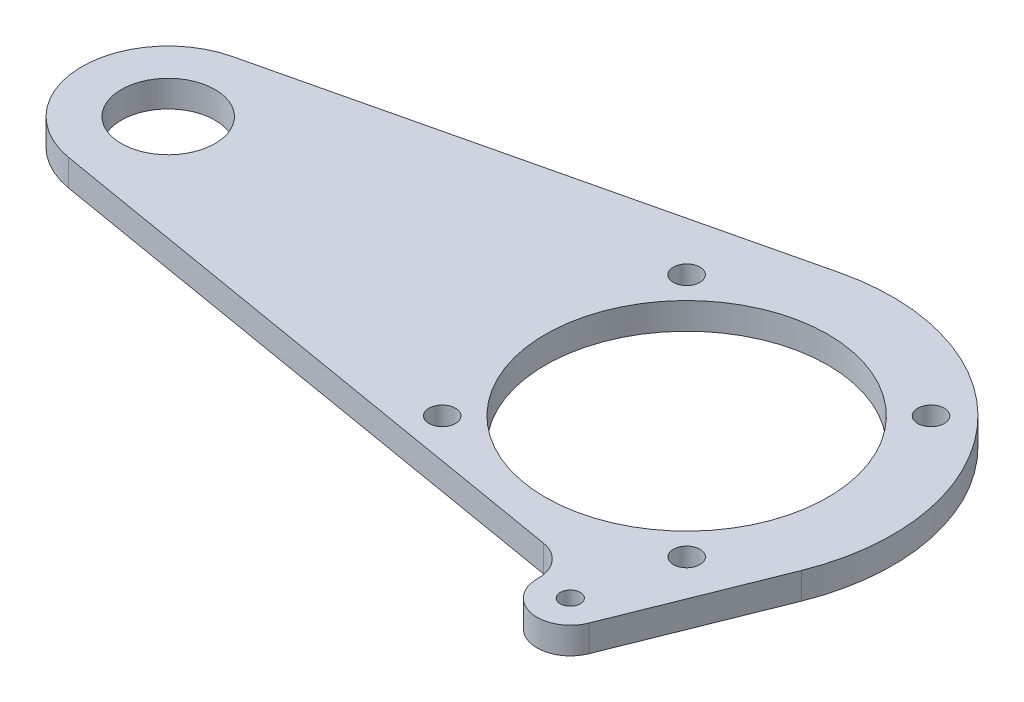
ISO-10303-21;
HEADER;
FILE_DESCRIPTION(('STEP AP214'),'2;1');
FILE_NAME('part.step','',(''),(''),'','','');
FILE_SCHEMA(('AUTOMOTIVE_DESIGN { 1 0 10303 214 1 1 1 1 }'));
ENDSEC;
DATA;
#1=APPLICATION_CONTEXT('core data for automotive mechanical design processes');
#2=APPLICATION_PROTOCOL_DEFINITION('international standard','automotive_design',2000,#1);
#3=PRODUCT_CONTEXT('',#1,'mechanical');
#4=PRODUCT('Part','Part','',(#3));
#5=PRODUCT_RELATED_PRODUCT_CATEGORY('part','',(#4));
#6=PRODUCT_DEFINITION_FORMATION('','',#4);
#7=PRODUCT_DEFINITION_CONTEXT('part definition',#1,'design');
#8=PRODUCT_DEFINITION('design','',#6,#7);
#9=PRODUCT_DEFINITION_SHAPE('','',#8);
#10=(LENGTH_UNIT() NAMED_UNIT(*) SI_UNIT(.MILLI.,.METRE.));
#11=(NAMED_UNIT(*) PLANE_ANGLE_UNIT() SI_UNIT($,.RADIAN.));
#12=(NAMED_UNIT(*) SI_UNIT($,.STERADIAN.) SOLID_ANGLE_UNIT());
#13=UNCERTAINTY_MEASURE_WITH_UNIT(LENGTH_MEASURE(1.E-05),#10,'distance_accuracy_value','');
#14=(GEOMETRIC_REPRESENTATION_CONTEXT(3) GLOBAL_UNCERTAINTY_ASSIGNED_CONTEXT((#13)) GLOBAL_UNIT_ASSIGNED_CONTEXT((#10,
#11,#12)) REPRESENTATION_CONTEXT('',''));
#15=CARTESIAN_POINT('',(0.,0.,0.));
#16=DIRECTION('',(0.,0.,1.));
#17=DIRECTION('',(1.,0.,0.));
#18=AXIS2_PLACEMENT_3D('',#15,#16,#17);
#19=CARTESIAN_POINT('',(5.00230545194057,4.,32.2852822231327));
#20=DIRECTION('',(0.,-1.,0.));
#21=DIRECTION('',(0.,0.,1.));
#22=AXIS2_PLACEMENT_3D('',#19,#20,#21);
#23=CYLINDRICAL_SURFACE('',#22,5.);
#24=CARTESIAN_POINT('',(5.00230545194057,0.,32.2852822231327));
#25=DIRECTION('',(0.,-1.,0.));
#26=DIRECTION('',(0.,0.,-1.));
#27=AXIS2_PLACEMENT_3D('',#24,#25,#26);
#28=CIRCLE('',#27,5.);
#29=CARTESIAN_POINT('',(5.8356387852739,0.,27.3552157372163));
#30=VERTEX_POINT('',#29);
#31=CARTESIAN_POINT('',(10.0011527259703,0.,32.3926411115663));
#32=VERTEX_POINT('',#31);
#33=EDGE_CURVE('E158',#30,#32,#28,.T.);
#34=ORIENTED_EDGE('',*,*,#33,.T.);
#35=DIRECTION('',(0.,-1.,0.));
#36=VECTOR('',#35,1.);
#37=CARTESIAN_POINT('',(10.0011527259703,4.,32.3926411115663));
#38=LINE('',#37,#36);
#39=CARTESIAN_POINT('',(10.0011527259703,4.,32.3926411115663));
#40=VERTEX_POINT('',#39);
#41=EDGE_CURVE('E154',#40,#32,#38,.T.);
#42=ORIENTED_EDGE('',*,*,#41,.F.);
#43=CARTESIAN_POINT('',(5.00230545194057,4.,32.2852822231327));
#44=DIRECTION('',(0.,-1.,0.));
#45=DIRECTION('',(0.,0.,-1.));
#46=AXIS2_PLACEMENT_3D('',#43,#44,#45);
#47=CIRCLE('',#46,5.);
#48=CARTESIAN_POINT('',(5.8356387852739,4.,27.3552157372163));
#49=VERTEX_POINT('',#48);
#50=EDGE_CURVE('E209',#49,#40,#47,.T.);
#51=ORIENTED_EDGE('',*,*,#50,.F.);
#52=DIRECTION('',(0.,-1.,0.));
#53=VECTOR('',#52,1.);
#54=CARTESIAN_POINT('',(5.8356387852739,4.,27.3552157372163));
#55=LINE('',#54,#53);
#56=EDGE_CURVE('E11',#49,#30,#55,.T.);
#57=ORIENTED_EDGE('',*,*,#56,.T.);
#58=EDGE_LOOP('',(#34,#42,#51,#57));
#59=FACE_BOUND('',#58,.T.);
#60=ADVANCED_FACE('F45',(#59),#23,.F.);
#61=CARTESIAN_POINT('',(-4.33333333333333,4.,25.636345726765));
#62=DIRECTION('',(-0.166666666666667,0.,0.986013297183269));
#63=DIRECTION('',(-0.986013297183269,0.,-0.166666666666667));
#64=AXIS2_PLACEMENT_3D('',#61,#62,#63);
#65=PLANE('',#64);
#66=DIRECTION('',(0.986013297183269,0.,0.166666666666667));
#67=VECTOR('',#66,1.);
#68=CARTESIAN_POINT('',(-4.33333333333333,0.,25.636345726765));
#69=LINE('',#68,#67);
#70=CARTESIAN_POINT('',(-80.1666666666666,0.,12.8181728633825));
#71=VERTEX_POINT('',#70);
#72=EDGE_CURVE('E161',#71,#30,#69,.T.);
#73=ORIENTED_EDGE('',*,*,#72,.T.);
#74=ORIENTED_EDGE('',*,*,#56,.F.);
#75=DIRECTION('',(0.986013297183269,0.,0.166666666666667));
#76=VECTOR('',#75,1.);
#77=CARTESIAN_POINT('',(-4.33333333333333,4.,25.636345726765));
#78=LINE('',#77,#76);
#79=CARTESIAN_POINT('',(-80.1666666666666,4.,12.8181728633825));
#80=VERTEX_POINT('',#79);
#81=EDGE_CURVE('E97',#80,#49,#78,.T.);
#82=ORIENTED_EDGE('',*,*,#81,.F.);
#83=DIRECTION('',(0.,-1.,0.));
#84=VECTOR('',#83,1.);
#85=CARTESIAN_POINT('',(-80.1666666666666,4.,12.8181728633825));
#86=LINE('',#85,#84);
#87=EDGE_CURVE('E54',#80,#71,#86,.T.);
#88=ORIENTED_EDGE('',*,*,#87,.T.);
#89=EDGE_LOOP('',(#73,#74,#82,#88));
#90=FACE_BOUND('',#89,.T.);
#91=ADVANCED_FACE('F201',(#90),#65,.T.);
#92=CARTESIAN_POINT('',(-78.,4.,0.));
#93=DIRECTION('',(0.,-1.,0.));
#94=DIRECTION('',(0.,0.,1.));
#95=AXIS2_PLACEMENT_3D('',#92,#93,#94);
#96=CYLINDRICAL_SURFACE('',#95,13.);
#97=CARTESIAN_POINT('',(-78.,0.,0.));
#98=DIRECTION('',(0.,-1.,0.));
#99=DIRECTION('',(0.,0.,-1.));
#100=AXIS2_PLACEMENT_3D('',#97,#98,#99);
#101=CIRCLE('',#100,13.);
#102=CARTESIAN_POINT('',(-81.,0.,-12.6491106406735));
#103=VERTEX_POINT('',#102);
#104=EDGE_CURVE('E163',#71,#103,#101,.T.);
#105=ORIENTED_EDGE('',*,*,#104,.F.);
#106=ORIENTED_EDGE('',*,*,#87,.F.);
#107=CARTESIAN_POINT('',(-78.,4.,0.));
#108=DIRECTION('',(0.,-1.,0.));
#109=DIRECTION('',(0.,0.,-1.));
#110=AXIS2_PLACEMENT_3D('',#107,#108,#109);
#111=CIRCLE('',#110,13.);
#112=CARTESIAN_POINT('',(-81.,4.,-12.6491106406735));
#113=VERTEX_POINT('',#112);
#114=EDGE_CURVE('E131',#80,#113,#111,.T.);
#115=ORIENTED_EDGE('',*,*,#114,.T.);
#116=DIRECTION('',(0.,-1.,0.));
#117=VECTOR('',#116,1.);
#118=CARTESIAN_POINT('',(-81.,4.,-12.6491106406735));
#119=LINE('',#118,#117);
#120=EDGE_CURVE('E195',#113,#103,#119,.T.);
#121=ORIENTED_EDGE('',*,*,#120,.T.);
#122=EDGE_LOOP('',(#105,#106,#115,#121));
#123=FACE_BOUND('',#122,.T.);
#124=ADVANCED_FACE('F214',(#123),#96,.T.);
#125=CARTESIAN_POINT('',(-7.15384615384617,4.,-30.1632638354523));
#126=DIRECTION('',(0.230769230769231,0.,0.97300851082104));
#127=DIRECTION('',(-0.97300851082104,0.,0.230769230769231));
#128=AXIS2_PLACEMENT_3D('',#125,#126,#127);
#129=PLANE('',#128);
#130=DIRECTION('',(0.97300851082104,0.,-0.230769230769231));
#131=VECTOR('',#130,1.);
#132=CARTESIAN_POINT('',(-7.15384615384617,0.,-30.1632638354523));
#133=LINE('',#132,#131);
#134=CARTESIAN_POINT('',(-7.15384615384616,0.,-30.1632638354523));
#135=VERTEX_POINT('',#134);
#136=EDGE_CURVE('E166',#103,#135,#133,.T.);
#137=ORIENTED_EDGE('',*,*,#136,.F.);
#138=ORIENTED_EDGE('',*,*,#120,.F.);
#139=DIRECTION('',(0.97300851082104,0.,-0.230769230769231));
#140=VECTOR('',#139,1.);
#141=CARTESIAN_POINT('',(-7.15384615384617,4.,-30.1632638354523));
#142=LINE('',#141,#140);
#143=CARTESIAN_POINT('',(-7.15384615384616,4.,-30.1632638354523));
#144=VERTEX_POINT('',#143);
#145=EDGE_CURVE('E129',#113,#144,#142,.T.);
#146=ORIENTED_EDGE('',*,*,#145,.T.);
#147=DIRECTION('',(0.,-1.,0.));
#148=VECTOR('',#147,1.);
#149=CARTESIAN_POINT('',(-7.15384615384616,4.,-30.1632638354523));
#150=LINE('',#149,#148);
#151=EDGE_CURVE('E123',#144,#135,#150,.T.);
#152=ORIENTED_EDGE('',*,*,#151,.T.);
#153=EDGE_LOOP('',(#137,#138,#146,#152));
#154=FACE_BOUND('',#153,.T.);
#155=ADVANCED_FACE('F217',(#154),#129,.F.);
#156=CARTESIAN_POINT('',(0.,4.,0.));
#157=DIRECTION('',(0.,-1.,0.));
#158=DIRECTION('',(0.,0.,1.));
#159=AXIS2_PLACEMENT_3D('',#156,#157,#158);
#160=CYLINDRICAL_SURFACE('',#159,31.);
#161=CARTESIAN_POINT('',(0.,0.,0.));
#162=DIRECTION('',(0.,-1.,0.));
#163=DIRECTION('',(0.,0.,-1.));
#164=AXIS2_PLACEMENT_3D('',#161,#162,#163);
#165=CIRCLE('',#164,31.);
#166=CARTESIAN_POINT('',(28.7815359370047,0.,11.5162141829209));
#167=VERTEX_POINT('',#166);
#168=EDGE_CURVE('E169',#135,#167,#165,.T.);
#169=ORIENTED_EDGE('',*,*,#168,.F.);
#170=ORIENTED_EDGE('',*,*,#151,.F.);
#171=CARTESIAN_POINT('',(0.,4.,0.));
#172=DIRECTION('',(0.,-1.,0.));
#173=DIRECTION('',(0.,0.,-1.));
#174=AXIS2_PLACEMENT_3D('',#171,#172,#173);
#175=CIRCLE('',#174,31.);
#176=CARTESIAN_POINT('',(28.7815359370047,4.,11.5162141829209));
#177=VERTEX_POINT('',#176);
#178=EDGE_CURVE('E113',#144,#177,#175,.T.);
#179=ORIENTED_EDGE('',*,*,#178,.T.);
#180=DIRECTION('',(0.,-1.,0.));
#181=VECTOR('',#180,1.);
#182=CARTESIAN_POINT('',(28.7815359370047,4.,11.5162141829209));
#183=LINE('',#182,#181);
#184=EDGE_CURVE('E118',#177,#167,#183,.T.);
#185=ORIENTED_EDGE('',*,*,#184,.T.);
#186=EDGE_LOOP('',(#169,#170,#179,#185));
#187=FACE_BOUND('',#186,.T.);
#188=ADVANCED_FACE('F126',(#187),#160,.T.);
#189=CARTESIAN_POINT('',(28.7815359370047,4.,11.5162141829209));
#190=DIRECTION('',(0.928436643129183,0.,0.371490780094224));
#191=DIRECTION('',(-0.371490780094224,0.,0.928436643129183));
#192=AXIS2_PLACEMENT_3D('',#189,#190,#191);
#193=PLANE('',#192);
#194=DIRECTION('',(0.371490780094224,0.,-0.928436643129183));
#195=VECTOR('',#194,1.);
#196=CARTESIAN_POINT('',(28.7815359370047,0.,11.5162141829209));
#197=LINE('',#196,#195);
#198=CARTESIAN_POINT('',(19.6421832156459,0.,34.3574539004711));
#199=VERTEX_POINT('',#198);
#200=EDGE_CURVE('E120',#199,#167,#197,.T.);
#201=ORIENTED_EDGE('',*,*,#200,.T.);
#202=ORIENTED_EDGE('',*,*,#184,.F.);
#203=DIRECTION('',(0.371490780094224,0.,-0.928436643129183));
#204=VECTOR('',#203,1.);
#205=CARTESIAN_POINT('',(28.7815359370047,4.,11.5162141829209));
#206=LINE('',#205,#204);
#207=CARTESIAN_POINT('',(19.6421832156459,4.,34.3574539004711));
#208=VERTEX_POINT('',#207);
#209=EDGE_CURVE('E108',#208,#177,#206,.T.);
#210=ORIENTED_EDGE('',*,*,#209,.F.);
#211=DIRECTION('',(0.,-1.,0.));
#212=VECTOR('',#211,1.);
#213=CARTESIAN_POINT('',(19.6421832156459,4.,34.3574539004711));
#214=LINE('',#213,#212);
#215=EDGE_CURVE('E124',#208,#199,#214,.T.);
#216=ORIENTED_EDGE('',*,*,#215,.T.);
#217=EDGE_LOOP('',(#201,#202,#210,#216));
#218=FACE_BOUND('',#217,.T.);
#219=ADVANCED_FACE('F119',(#218),#193,.T.);
#220=CARTESIAN_POINT('',(15.,4.,32.5));
#221=DIRECTION('',(0.,-1.,0.));
#222=DIRECTION('',(0.,0.,1.));
#223=AXIS2_PLACEMENT_3D('',#220,#221,#222);
#224=CYLINDRICAL_SURFACE('',#223,1.5);
#225=CARTESIAN_POINT('',(15.,4.,32.5));
#226=DIRECTION('',(0.,-1.,0.));
#227=DIRECTION('',(0.,0.,-1.));
#228=AXIS2_PLACEMENT_3D('',#225,#226,#227);
#229=CIRCLE('',#228,1.5);
#230=CARTESIAN_POINT('',(15.,4.,31.));
#231=VERTEX_POINT('',#230);
#232=EDGE_CURVE('E148',#231,#231,#229,.T.);
#233=ORIENTED_EDGE('',*,*,#232,.F.);
#234=EDGE_LOOP('',(#233));
#235=FACE_BOUND('',#234,.T.);
#236=CARTESIAN_POINT('',(15.,0.,32.5));
#237=DIRECTION('',(0.,-1.,0.));
#238=DIRECTION('',(0.,0.,-1.));
#239=AXIS2_PLACEMENT_3D('',#236,#237,#238);
#240=CIRCLE('',#239,1.5);
#241=CARTESIAN_POINT('',(15.,0.,31.));
#242=VERTEX_POINT('',#241);
#243=EDGE_CURVE('E185',#242,#242,#240,.T.);
#244=ORIENTED_EDGE('',*,*,#243,.T.);
#245=EDGE_LOOP('',(#244));
#246=FACE_BOUND('',#245,.T.);
#247=ADVANCED_FACE('F259',(#235,#246),#224,.F.);
#248=CARTESIAN_POINT('',(-18.3847763108502,4.,18.3847763108503));
#249=DIRECTION('',(0.,-1.,0.));
#250=DIRECTION('',(0.,0.,1.));
#251=AXIS2_PLACEMENT_3D('',#248,#249,#250);
#252=CYLINDRICAL_SURFACE('',#251,1.99999999999999);
#253=CARTESIAN_POINT('',(-18.3847763108502,4.,18.3847763108503));
#254=DIRECTION('',(0.,-1.,0.));
#255=DIRECTION('',(0.,0.,-1.));
#256=AXIS2_PLACEMENT_3D('',#253,#254,#255);
#257=CIRCLE('',#256,1.99999999999999);
#258=CARTESIAN_POINT('',(-18.3847763108502,4.,16.3847763108503));
#259=VERTEX_POINT('',#258);
#260=EDGE_CURVE('E145',#259,#259,#257,.T.);
#261=ORIENTED_EDGE('',*,*,#260,.F.);
#262=EDGE_LOOP('',(#261));
#263=FACE_BOUND('',#262,.T.);
#264=CARTESIAN_POINT('',(-18.3847763108502,0.,18.3847763108503));
#265=DIRECTION('',(0.,-1.,0.));
#266=DIRECTION('',(0.,0.,-1.));
#267=AXIS2_PLACEMENT_3D('',#264,#265,#266);
#268=CIRCLE('',#267,1.99999999999999);
#269=CARTESIAN_POINT('',(-18.3847763108502,0.,16.3847763108503));
#270=VERTEX_POINT('',#269);
#271=EDGE_CURVE('E182',#270,#270,#268,.T.);
#272=ORIENTED_EDGE('',*,*,#271,.T.);
#273=EDGE_LOOP('',(#272));
#274=FACE_BOUND('',#273,.T.);
#275=ADVANCED_FACE('F268',(#263,#274),#252,.F.);
#276=CARTESIAN_POINT('',(18.3847763108503,4.,18.3847763108502));
#277=DIRECTION('',(0.,-1.,0.));
#278=DIRECTION('',(0.,0.,1.));
#279=AXIS2_PLACEMENT_3D('',#276,#277,#278);
#280=CYLINDRICAL_SURFACE('',#279,2.00000000000001);
#281=CARTESIAN_POINT('',(18.3847763108503,4.,18.3847763108502));
#282=DIRECTION('',(0.,-1.,0.));
#283=DIRECTION('',(0.,0.,-1.));
#284=AXIS2_PLACEMENT_3D('',#281,#282,#283);
#285=CIRCLE('',#284,2.00000000000001);
#286=CARTESIAN_POINT('',(18.3847763108503,4.,16.3847763108502));
#287=VERTEX_POINT('',#286);
#288=EDGE_CURVE('E142',#287,#287,#285,.T.);
#289=ORIENTED_EDGE('',*,*,#288,.F.);
#290=EDGE_LOOP('',(#289));
#291=FACE_BOUND('',#290,.T.);
#292=CARTESIAN_POINT('',(18.3847763108503,0.,18.3847763108502));
#293=DIRECTION('',(0.,-1.,0.));
#294=DIRECTION('',(0.,0.,-1.));
#295=AXIS2_PLACEMENT_3D('',#292,#293,#294);
#296=CIRCLE('',#295,2.00000000000001);
#297=CARTESIAN_POINT('',(18.3847763108503,0.,16.3847763108502));
#298=VERTEX_POINT('',#297);
#299=EDGE_CURVE('E179',#298,#298,#296,.T.);
#300=ORIENTED_EDGE('',*,*,#299,.T.);
#301=EDGE_LOOP('',(#300));
#302=FACE_BOUND('',#301,.T.);
#303=ADVANCED_FACE('F278',(#291,#302),#280,.F.);
#304=CARTESIAN_POINT('',(18.3847763108502,4.,-18.3847763108503));
#305=DIRECTION('',(0.,-1.,0.));
#306=DIRECTION('',(0.,0.,1.));
#307=AXIS2_PLACEMENT_3D('',#304,#305,#306);
#308=CYLINDRICAL_SURFACE('',#307,2.);
#309=CARTESIAN_POINT('',(18.3847763108502,4.,-18.3847763108503));
#310=DIRECTION('',(0.,-1.,0.));
#311=DIRECTION('',(0.,0.,-1.));
#312=AXIS2_PLACEMENT_3D('',#309,#310,#311);
#313=CIRCLE('',#312,2.);
#314=CARTESIAN_POINT('',(18.3847763108502,4.,-20.3847763108503));
#315=VERTEX_POINT('',#314);
#316=EDGE_CURVE('E139',#315,#315,#313,.T.);
#317=ORIENTED_EDGE('',*,*,#316,.F.);
#318=EDGE_LOOP('',(#317));
#319=FACE_BOUND('',#318,.T.);
#320=CARTESIAN_POINT('',(18.3847763108502,0.,-18.3847763108503));
#321=DIRECTION('',(0.,-1.,0.));
#322=DIRECTION('',(0.,0.,-1.));
#323=AXIS2_PLACEMENT_3D('',#320,#321,#322);
#324=CIRCLE('',#323,2.);
#325=CARTESIAN_POINT('',(18.3847763108502,0.,-20.3847763108503));
#326=VERTEX_POINT('',#325);
#327=EDGE_CURVE('E176',#326,#326,#324,.T.);
#328=ORIENTED_EDGE('',*,*,#327,.T.);
#329=EDGE_LOOP('',(#328));
#330=FACE_BOUND('',#329,.T.);
#331=ADVANCED_FACE('F288',(#319,#330),#308,.F.);
#332=CARTESIAN_POINT('',(-18.3847763108503,4.,-18.3847763108502));
#333=DIRECTION('',(0.,-1.,0.));
#334=DIRECTION('',(0.,0.,1.));
#335=AXIS2_PLACEMENT_3D('',#332,#333,#334);
#336=CYLINDRICAL_SURFACE('',#335,2.);
#337=CARTESIAN_POINT('',(-18.3847763108503,4.,-18.3847763108502));
#338=DIRECTION('',(0.,-1.,0.));
#339=DIRECTION('',(0.,0.,-1.));
#340=AXIS2_PLACEMENT_3D('',#337,#338,#339);
#341=CIRCLE('',#340,2.);
#342=CARTESIAN_POINT('',(-18.3847763108503,4.,-20.3847763108502));
#343=VERTEX_POINT('',#342);
#344=EDGE_CURVE('E136',#343,#343,#341,.T.);
#345=ORIENTED_EDGE('',*,*,#344,.F.);
#346=EDGE_LOOP('',(#345));
#347=FACE_BOUND('',#346,.T.);
#348=CARTESIAN_POINT('',(-18.3847763108503,0.,-18.3847763108502));
#349=DIRECTION('',(0.,-1.,0.));
#350=DIRECTION('',(0.,0.,-1.));
#351=AXIS2_PLACEMENT_3D('',#348,#349,#350);
#352=CIRCLE('',#351,2.);
#353=CARTESIAN_POINT('',(-18.3847763108503,0.,-20.3847763108502));
#354=VERTEX_POINT('',#353);
#355=EDGE_CURVE('E173',#354,#354,#352,.T.);
#356=ORIENTED_EDGE('',*,*,#355,.T.);
#357=EDGE_LOOP('',(#356));
#358=FACE_BOUND('',#357,.T.);
#359=ADVANCED_FACE('F298',(#347,#358),#336,.F.);
#360=CARTESIAN_POINT('',(15.,4.,32.5));
#361=DIRECTION('',(0.,-1.,0.));
#362=DIRECTION('',(0.,0.,1.));
#363=AXIS2_PLACEMENT_3D('',#360,#361,#362);
#364=CYLINDRICAL_SURFACE('',#363,5.);
#365=CARTESIAN_POINT('',(15.,0.,32.5));
#366=DIRECTION('',(0.,-1.,0.));
#367=DIRECTION('',(0.,0.,-1.));
#368=AXIS2_PLACEMENT_3D('',#365,#366,#367);
#369=CIRCLE('',#368,5.);
#370=EDGE_CURVE('E85',#199,#32,#369,.T.);
#371=ORIENTED_EDGE('',*,*,#370,.F.);
#372=ORIENTED_EDGE('',*,*,#215,.F.);
#373=CARTESIAN_POINT('',(15.,4.,32.5));
#374=DIRECTION('',(0.,-1.,0.));
#375=DIRECTION('',(0.,0.,-1.));
#376=AXIS2_PLACEMENT_3D('',#373,#374,#375);
#377=CIRCLE('',#376,5.);
#378=EDGE_CURVE('E62',#208,#40,#377,.T.);
#379=ORIENTED_EDGE('',*,*,#378,.T.);
#380=ORIENTED_EDGE('',*,*,#41,.T.);
#381=EDGE_LOOP('',(#371,#372,#379,#380));
#382=FACE_BOUND('',#381,.T.);
#383=ADVANCED_FACE('F308',(#382),#364,.T.);
#384=CARTESIAN_POINT('',(0.,4.,0.));
#385=DIRECTION('',(0.,-1.,0.));
#386=DIRECTION('',(0.,0.,1.));
#387=AXIS2_PLACEMENT_3D('',#384,#385,#386);
#388=CYLINDRICAL_SURFACE('',#387,21.25);
#389=CARTESIAN_POINT('',(0.,4.,0.));
#390=DIRECTION('',(0.,-1.,0.));
#391=DIRECTION('',(0.,0.,-1.));
#392=AXIS2_PLACEMENT_3D('',#389,#390,#391);
#393=CIRCLE('',#392,21.25);
#394=CARTESIAN_POINT('',(0.,4.,-21.25));
#395=VERTEX_POINT('',#394);
#396=EDGE_CURVE('E191',#395,#395,#393,.T.);
#397=ORIENTED_EDGE('',*,*,#396,.F.);
#398=EDGE_LOOP('',(#397));
#399=FACE_BOUND('',#398,.T.);
#400=CARTESIAN_POINT('',(0.,0.,0.));
#401=DIRECTION('',(0.,-1.,0.));
#402=DIRECTION('',(0.,0.,-1.));
#403=AXIS2_PLACEMENT_3D('',#400,#401,#402);
#404=CIRCLE('',#403,21.25);
#405=CARTESIAN_POINT('',(0.,0.,-21.25));
#406=VERTEX_POINT('',#405);
#407=EDGE_CURVE('E155',#406,#406,#404,.T.);
#408=ORIENTED_EDGE('',*,*,#407,.T.);
#409=EDGE_LOOP('',(#408));
#410=FACE_BOUND('',#409,.T.);
#411=ADVANCED_FACE('F47',(#399,#410),#388,.F.);
#412=CARTESIAN_POINT('',(-78.,4.,0.));
#413=DIRECTION('',(0.,-1.,0.));
#414=DIRECTION('',(0.,0.,1.));
#415=AXIS2_PLACEMENT_3D('',#412,#413,#414);
#416=CYLINDRICAL_SURFACE('',#415,7.05);
#417=CARTESIAN_POINT('',(-78.,4.,0.));
#418=DIRECTION('',(0.,-1.,0.));
#419=DIRECTION('',(0.,0.,-1.));
#420=AXIS2_PLACEMENT_3D('',#417,#418,#419);
#421=CIRCLE('',#420,7.05);
#422=CARTESIAN_POINT('',(-78.,4.,-7.05));
#423=VERTEX_POINT('',#422);
#424=EDGE_CURVE('E151',#423,#423,#421,.T.);
#425=ORIENTED_EDGE('',*,*,#424,.F.);
#426=EDGE_LOOP('',(#425));
#427=FACE_BOUND('',#426,.T.);
#428=CARTESIAN_POINT('',(-78.,0.,0.));
#429=DIRECTION('',(0.,-1.,0.));
#430=DIRECTION('',(0.,0.,-1.));
#431=AXIS2_PLACEMENT_3D('',#428,#429,#430);
#432=CIRCLE('',#431,7.05);
#433=CARTESIAN_POINT('',(-78.,0.,-7.05));
#434=VERTEX_POINT('',#433);
#435=EDGE_CURVE('E188',#434,#434,#432,.T.);
#436=ORIENTED_EDGE('',*,*,#435,.T.);
#437=EDGE_LOOP('',(#436));
#438=FACE_BOUND('',#437,.T.);
#439=ADVANCED_FACE('F326',(#427,#438),#416,.F.);
#440=CARTESIAN_POINT('',(0.,4.,0.));
#441=DIRECTION('',(0.,1.,0.));
#442=DIRECTION('',(0.,0.,-1.));
#443=AXIS2_PLACEMENT_3D('',#440,#441,#442);
#444=PLANE('',#443);
#445=ORIENTED_EDGE('',*,*,#396,.T.);
#446=EDGE_LOOP('',(#445));
#447=FACE_BOUND('',#446,.T.);
#448=ORIENTED_EDGE('',*,*,#50,.T.);
#449=ORIENTED_EDGE('',*,*,#378,.F.);
#450=ORIENTED_EDGE('',*,*,#209,.T.);
#451=ORIENTED_EDGE('',*,*,#178,.F.);
#452=ORIENTED_EDGE('',*,*,#145,.F.);
#453=ORIENTED_EDGE('',*,*,#114,.F.);
#454=ORIENTED_EDGE('',*,*,#81,.T.);
#455=EDGE_LOOP('',(#448,#449,#450,#451,#452,#453,#454));
#456=FACE_BOUND('',#455,.T.);
#457=ORIENTED_EDGE('',*,*,#344,.T.);
#458=EDGE_LOOP('',(#457));
#459=FACE_BOUND('',#458,.T.);
#460=ORIENTED_EDGE('',*,*,#316,.T.);
#461=EDGE_LOOP('',(#460));
#462=FACE_BOUND('',#461,.T.);
#463=ORIENTED_EDGE('',*,*,#288,.T.);
#464=EDGE_LOOP('',(#463));
#465=FACE_BOUND('',#464,.T.);
#466=ORIENTED_EDGE('',*,*,#260,.T.);
#467=EDGE_LOOP('',(#466));
#468=FACE_BOUND('',#467,.T.);
#469=ORIENTED_EDGE('',*,*,#232,.T.);
#470=EDGE_LOOP('',(#469));
#471=FACE_BOUND('',#470,.T.);
#472=ORIENTED_EDGE('',*,*,#424,.T.);
#473=EDGE_LOOP('',(#472));
#474=FACE_BOUND('',#473,.T.);
#475=ADVANCED_FACE('F110',(#447,#456,#459,#462,#465,#468,#471,#474),#444,.T.);
#476=CARTESIAN_POINT('',(0.,0.,0.));
#477=DIRECTION('',(0.,1.,0.));
#478=DIRECTION('',(0.,0.,-1.));
#479=AXIS2_PLACEMENT_3D('',#476,#477,#478);
#480=PLANE('',#479);
#481=ORIENTED_EDGE('',*,*,#407,.F.);
#482=EDGE_LOOP('',(#481));
#483=FACE_BOUND('',#482,.T.);
#484=ORIENTED_EDGE('',*,*,#33,.F.);
#485=ORIENTED_EDGE('',*,*,#72,.F.);
#486=ORIENTED_EDGE('',*,*,#104,.T.);
#487=ORIENTED_EDGE('',*,*,#136,.T.);
#488=ORIENTED_EDGE('',*,*,#168,.T.);
#489=ORIENTED_EDGE('',*,*,#200,.F.);
#490=ORIENTED_EDGE('',*,*,#370,.T.);
#491=EDGE_LOOP('',(#484,#485,#486,#487,#488,#489,#490));
#492=FACE_BOUND('',#491,.T.);
#493=ORIENTED_EDGE('',*,*,#355,.F.);
#494=EDGE_LOOP('',(#493));
#495=FACE_BOUND('',#494,.T.);
#496=ORIENTED_EDGE('',*,*,#327,.F.);
#497=EDGE_LOOP('',(#496));
#498=FACE_BOUND('',#497,.T.);
#499=ORIENTED_EDGE('',*,*,#299,.F.);
#500=EDGE_LOOP('',(#499));
#501=FACE_BOUND('',#500,.T.);
#502=ORIENTED_EDGE('',*,*,#271,.F.);
#503=EDGE_LOOP('',(#502));
#504=FACE_BOUND('',#503,.T.);
#505=ORIENTED_EDGE('',*,*,#243,.F.);
#506=EDGE_LOOP('',(#505));
#507=FACE_BOUND('',#506,.T.);
#508=ORIENTED_EDGE('',*,*,#435,.F.);
#509=EDGE_LOOP('',(#508));
#510=FACE_BOUND('',#509,.T.);
#511=ADVANCED_FACE('F204',(#483,#492,#495,#498,#501,#504,#507,#510),#480,.F.);
#512=CLOSED_SHELL('',(#60,#91,#124,#155,#188,#219,#247,#275,#303,#331,#359,#383,#411,#439,#475,#511));
#513=MANIFOLD_SOLID_BREP('B2',#512);
#514=ADVANCED_BREP_SHAPE_REPRESENTATION('',(#18,#513),#14);
#515=SHAPE_DEFINITION_REPRESENTATION(#9,#514);
ENDSEC;
END-ISO-10303-21;
